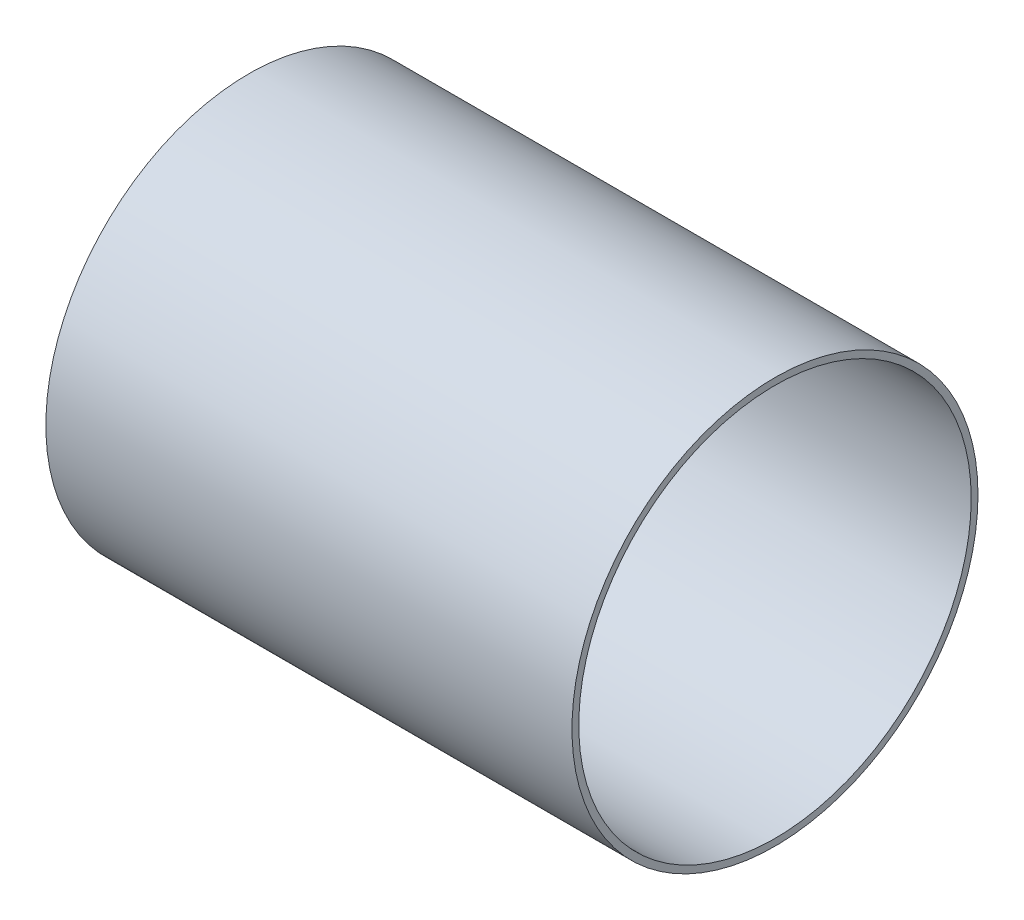
ISO-10303-21;
HEADER;
FILE_DESCRIPTION(('STEP AP214'),'2;1');
FILE_NAME('part.step','',(''),(''),'','','');
FILE_SCHEMA(('AUTOMOTIVE_DESIGN { 1 0 10303 214 1 1 1 1 }'));
ENDSEC;
DATA;
#1=APPLICATION_CONTEXT('core data for automotive mechanical design processes');
#2=APPLICATION_PROTOCOL_DEFINITION('international standard','automotive_design',2000,#1);
#3=PRODUCT_CONTEXT('',#1,'mechanical');
#4=PRODUCT('Part','Part','',(#3));
#5=PRODUCT_RELATED_PRODUCT_CATEGORY('part','',(#4));
#6=PRODUCT_DEFINITION_FORMATION('','',#4);
#7=PRODUCT_DEFINITION_CONTEXT('part definition',#1,'design');
#8=PRODUCT_DEFINITION('design','',#6,#7);
#9=PRODUCT_DEFINITION_SHAPE('','',#8);
#10=(LENGTH_UNIT() NAMED_UNIT(*) SI_UNIT(.MILLI.,.METRE.));
#11=(NAMED_UNIT(*) PLANE_ANGLE_UNIT() SI_UNIT($,.RADIAN.));
#12=(NAMED_UNIT(*) SI_UNIT($,.STERADIAN.) SOLID_ANGLE_UNIT());
#13=UNCERTAINTY_MEASURE_WITH_UNIT(LENGTH_MEASURE(1.E-05),#10,'distance_accuracy_value','');
#14=(GEOMETRIC_REPRESENTATION_CONTEXT(3) GLOBAL_UNCERTAINTY_ASSIGNED_CONTEXT((#13)) GLOBAL_UNIT_ASSIGNED_CONTEXT((#10,
#11,#12)) REPRESENTATION_CONTEXT('',''));
#15=CARTESIAN_POINT('',(0.,0.,0.));
#16=DIRECTION('',(0.,0.,1.));
#17=DIRECTION('',(1.,0.,0.));
#18=AXIS2_PLACEMENT_3D('',#15,#16,#17);
#19=CARTESIAN_POINT('',(27.9,0.,0.));
#20=DIRECTION('',(1.,0.,0.));
#21=DIRECTION('',(0.,0.,-1.));
#22=AXIS2_PLACEMENT_3D('',#19,#20,#21);
#23=PLANE('',#22);
#24=CARTESIAN_POINT('',(27.9,0.,0.));
#25=DIRECTION('',(1.,0.,0.));
#26=DIRECTION('',(0.,0.,-1.));
#27=AXIS2_PLACEMENT_3D('',#24,#25,#26);
#28=CIRCLE('',#27,10.765);
#29=CARTESIAN_POINT('',(27.9,0.,-10.765));
#30=VERTEX_POINT('',#29);
#31=EDGE_CURVE('E10',#30,#30,#28,.T.);
#32=ORIENTED_EDGE('',*,*,#31,.T.);
#33=EDGE_LOOP('',(#32));
#34=FACE_BOUND('',#33,.T.);
#35=CARTESIAN_POINT('',(27.9,0.,0.));
#36=DIRECTION('',(1.,0.,0.));
#37=DIRECTION('',(0.,0.,-1.));
#38=AXIS2_PLACEMENT_3D('',#35,#36,#37);
#39=CIRCLE('',#38,10.405);
#40=CARTESIAN_POINT('',(27.9,0.,-10.405));
#41=VERTEX_POINT('',#40);
#42=EDGE_CURVE('E46',#41,#41,#39,.T.);
#43=ORIENTED_EDGE('',*,*,#42,.F.);
#44=EDGE_LOOP('',(#43));
#45=FACE_BOUND('',#44,.T.);
#46=ADVANCED_FACE('F35',(#34,#45),#23,.T.);
#47=CARTESIAN_POINT('',(0.,0.,0.));
#48=DIRECTION('',(1.,0.,0.));
#49=DIRECTION('',(0.,0.,-1.));
#50=AXIS2_PLACEMENT_3D('',#47,#48,#49);
#51=PLANE('',#50);
#52=CARTESIAN_POINT('',(0.,0.,0.));
#53=DIRECTION('',(1.,0.,0.));
#54=DIRECTION('',(0.,0.,-1.));
#55=AXIS2_PLACEMENT_3D('',#52,#53,#54);
#56=CIRCLE('',#55,10.765);
#57=CARTESIAN_POINT('',(0.,0.,-10.765));
#58=VERTEX_POINT('',#57);
#59=EDGE_CURVE('E39',#58,#58,#56,.T.);
#60=ORIENTED_EDGE('',*,*,#59,.F.);
#61=EDGE_LOOP('',(#60));
#62=FACE_BOUND('',#61,.T.);
#63=CARTESIAN_POINT('',(0.,0.,0.));
#64=DIRECTION('',(1.,0.,0.));
#65=DIRECTION('',(0.,0.,-1.));
#66=AXIS2_PLACEMENT_3D('',#63,#64,#65);
#67=CIRCLE('',#66,10.405);
#68=CARTESIAN_POINT('',(0.,0.,-10.405));
#69=VERTEX_POINT('',#68);
#70=EDGE_CURVE('E48',#69,#69,#67,.T.);
#71=ORIENTED_EDGE('',*,*,#70,.T.);
#72=EDGE_LOOP('',(#71));
#73=FACE_BOUND('',#72,.T.);
#74=ADVANCED_FACE('F58',(#62,#73),#51,.F.);
#75=CARTESIAN_POINT('',(27.9,0.,0.));
#76=DIRECTION('',(-1.,0.,0.));
#77=DIRECTION('',(0.,0.,1.));
#78=AXIS2_PLACEMENT_3D('',#75,#76,#77);
#79=CYLINDRICAL_SURFACE('',#78,10.765);
#80=ORIENTED_EDGE('',*,*,#31,.F.);
#81=EDGE_LOOP('',(#80));
#82=FACE_BOUND('',#81,.T.);
#83=ORIENTED_EDGE('',*,*,#59,.T.);
#84=EDGE_LOOP('',(#83));
#85=FACE_BOUND('',#84,.T.);
#86=ADVANCED_FACE('F37',(#82,#85),#79,.T.);
#87=CARTESIAN_POINT('',(27.9,0.,0.));
#88=DIRECTION('',(-1.,0.,0.));
#89=DIRECTION('',(0.,0.,1.));
#90=AXIS2_PLACEMENT_3D('',#87,#88,#89);
#91=CYLINDRICAL_SURFACE('',#90,10.405);
#92=ORIENTED_EDGE('',*,*,#42,.T.);
#93=EDGE_LOOP('',(#92));
#94=FACE_BOUND('',#93,.T.);
#95=ORIENTED_EDGE('',*,*,#70,.F.);
#96=EDGE_LOOP('',(#95));
#97=FACE_BOUND('',#96,.T.);
#98=ADVANCED_FACE('F54',(#94,#97),#91,.F.);
#99=CLOSED_SHELL('',(#46,#74,#86,#98));
#100=MANIFOLD_SOLID_BREP('B2',#99);
#101=ADVANCED_BREP_SHAPE_REPRESENTATION('',(#18,#100),#14);
#102=SHAPE_DEFINITION_REPRESENTATION(#9,#101);
ENDSEC;
END-ISO-10303-21;
